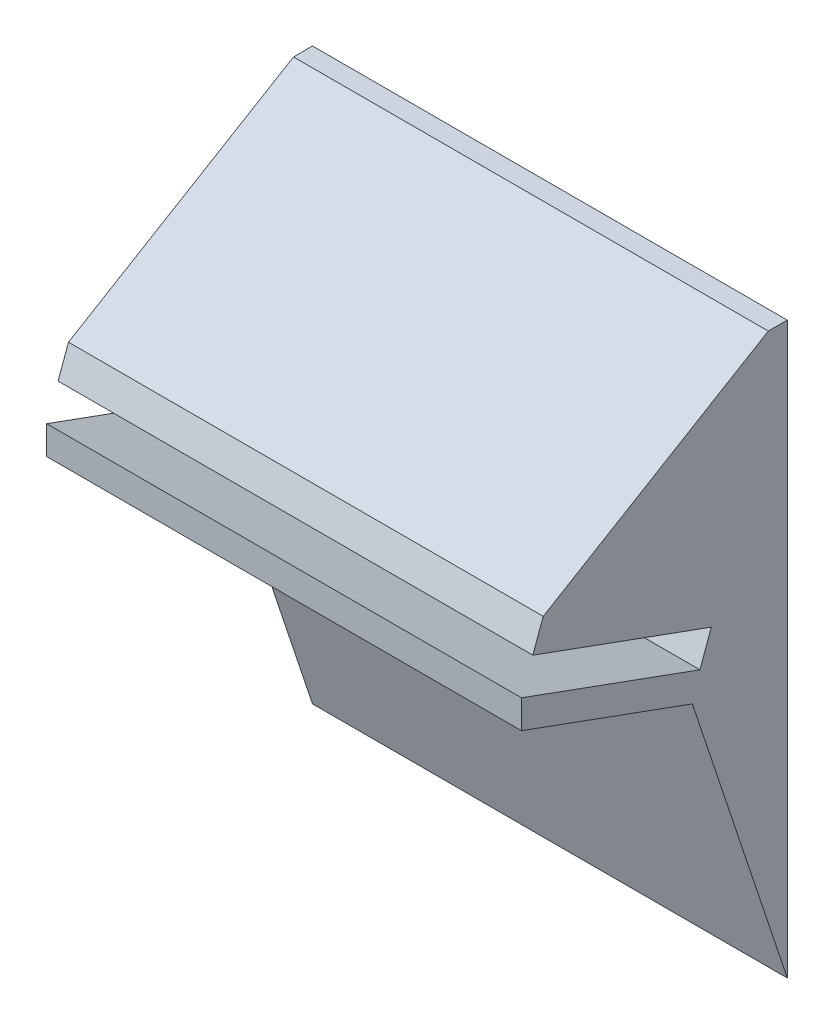
ISO-10303-21;
HEADER;
FILE_DESCRIPTION(('STEP AP214'),'2;1');
FILE_NAME('part.step','',(''),(''),'','','');
FILE_SCHEMA(('AUTOMOTIVE_DESIGN { 1 0 10303 214 1 1 1 1 }'));
ENDSEC;
DATA;
#1=APPLICATION_CONTEXT('core data for automotive mechanical design processes');
#2=APPLICATION_PROTOCOL_DEFINITION('international standard','automotive_design',2000,#1);
#3=PRODUCT_CONTEXT('',#1,'mechanical');
#4=PRODUCT('Part','Part','',(#3));
#5=PRODUCT_RELATED_PRODUCT_CATEGORY('part','',(#4));
#6=PRODUCT_DEFINITION_FORMATION('','',#4);
#7=PRODUCT_DEFINITION_CONTEXT('part definition',#1,'design');
#8=PRODUCT_DEFINITION('design','',#6,#7);
#9=PRODUCT_DEFINITION_SHAPE('','',#8);
#10=(LENGTH_UNIT() NAMED_UNIT(*) SI_UNIT(.MILLI.,.METRE.));
#11=(NAMED_UNIT(*) PLANE_ANGLE_UNIT() SI_UNIT($,.RADIAN.));
#12=(NAMED_UNIT(*) SI_UNIT($,.STERADIAN.) SOLID_ANGLE_UNIT());
#13=UNCERTAINTY_MEASURE_WITH_UNIT(LENGTH_MEASURE(1.E-05),#10,'distance_accuracy_value','');
#14=(GEOMETRIC_REPRESENTATION_CONTEXT(3) GLOBAL_UNCERTAINTY_ASSIGNED_CONTEXT((#13)) GLOBAL_UNIT_ASSIGNED_CONTEXT((#10,
#11,#12)) REPRESENTATION_CONTEXT('',''));
#15=CARTESIAN_POINT('',(0.,0.,0.));
#16=DIRECTION('',(0.,0.,1.));
#17=DIRECTION('',(1.,0.,0.));
#18=AXIS2_PLACEMENT_3D('',#15,#16,#17);
#19=CARTESIAN_POINT('',(0.,0.,2.));
#20=DIRECTION('',(1.,0.,0.));
#21=DIRECTION('',(0.,0.,-1.));
#22=AXIS2_PLACEMENT_3D('',#19,#20,#21);
#23=PLANE('',#22);
#24=DIRECTION('',(0.,-1.,0.));
#25=VECTOR('',#24,1.);
#26=CARTESIAN_POINT('',(0.,0.,0.));
#27=LINE('',#26,#25);
#28=CARTESIAN_POINT('',(0.,30.,0.));
#29=VERTEX_POINT('',#28);
#30=CARTESIAN_POINT('',(0.,-30.,0.));
#31=VERTEX_POINT('',#30);
#32=EDGE_CURVE('E118',#29,#31,#27,.T.);
#33=ORIENTED_EDGE('',*,*,#32,.T.);
#34=DIRECTION('',(0.,0.948683298050514,0.316227766016838));
#35=VECTOR('',#34,1.);
#36=CARTESIAN_POINT('',(0.,-30.,0.));
#37=LINE('',#36,#35);
#38=CARTESIAN_POINT('',(0.,0.,10.));
#39=VERTEX_POINT('',#38);
#40=EDGE_CURVE('E126',#31,#39,#37,.T.);
#41=ORIENTED_EDGE('',*,*,#40,.T.);
#42=DIRECTION('',(0.,0.342020143325673,0.939692620785907));
#43=VECTOR('',#42,1.);
#44=CARTESIAN_POINT('',(0.,0.,10.));
#45=LINE('',#44,#43);
#46=CARTESIAN_POINT('',(0.,6.54816042889604,27.9909229173579));
#47=VERTEX_POINT('',#46);
#48=EDGE_CURVE('E146',#39,#47,#45,.T.);
#49=ORIENTED_EDGE('',*,*,#48,.T.);
#50=DIRECTION('',(0.,1.,0.));
#51=VECTOR('',#50,1.);
#52=CARTESIAN_POINT('',(0.,6.54816042889604,27.9909229173579));
#53=LINE('',#52,#51);
#54=CARTESIAN_POINT('',(0.,9.54816042889604,27.9909229173579));
#55=VERTEX_POINT('',#54);
#56=EDGE_CURVE('E144',#47,#55,#53,.T.);
#57=ORIENTED_EDGE('',*,*,#56,.T.);
#58=DIRECTION('',(0.,-0.342020143325679,-0.939692620785905));
#59=VECTOR('',#58,1.);
#60=CARTESIAN_POINT('',(0.,9.54816042889604,27.9909229173579));
#61=LINE('',#60,#59);
#62=CARTESIAN_POINT('',(0.,2.70775756238245,9.19707050163985));
#63=VERTEX_POINT('',#62);
#64=EDGE_CURVE('E142',#55,#63,#61,.T.);
#65=ORIENTED_EDGE('',*,*,#64,.T.);
#66=DIRECTION('',(0.,0.939692620785907,-0.342020143325673));
#67=VECTOR('',#66,1.);
#68=CARTESIAN_POINT('',(0.,2.70775756238245,9.19707050163985));
#69=LINE('',#68,#67);
#70=CARTESIAN_POINT('',(0.,5.99668173513313,8.));
#71=VERTEX_POINT('',#70);
#72=EDGE_CURVE('E67',#63,#71,#69,.T.);
#73=ORIENTED_EDGE('',*,*,#72,.T.);
#74=DIRECTION('',(0.,0.342020143325673,0.939692620785907));
#75=VECTOR('',#74,1.);
#76=CARTESIAN_POINT('',(0.,5.99668173513313,8.));
#77=LINE('',#76,#75);
#78=CARTESIAN_POINT('',(0.,12.8370846016466,26.7938524157181));
#79=VERTEX_POINT('',#78);
#80=EDGE_CURVE('E62',#71,#79,#77,.T.);
#81=ORIENTED_EDGE('',*,*,#80,.T.);
#82=DIRECTION('',(0.,0.939692620785907,-0.342020143325673));
#83=VECTOR('',#82,1.);
#84=CARTESIAN_POINT('',(0.,12.8370846016466,26.7938524157181));
#85=LINE('',#84,#83);
#86=CARTESIAN_POINT('',(0.,15.8370846016466,25.7019417129195));
#87=VERTEX_POINT('',#86);
#88=EDGE_CURVE('E137',#79,#87,#85,.T.);
#89=ORIENTED_EDGE('',*,*,#88,.T.);
#90=DIRECTION('',(0.,0.512943701070108,-0.858422250138299));
#91=VECTOR('',#90,1.);
#92=CARTESIAN_POINT('',(0.,15.8370846016466,25.7019417129195));
#93=LINE('',#92,#91);
#94=CARTESIAN_POINT('',(0.,30.,2.));
#95=VERTEX_POINT('',#94);
#96=EDGE_CURVE('E148',#87,#95,#93,.T.);
#97=ORIENTED_EDGE('',*,*,#96,.T.);
#98=DIRECTION('',(0.,0.,-1.));
#99=VECTOR('',#98,1.);
#100=CARTESIAN_POINT('',(0.,30.,2.));
#101=LINE('',#100,#99);
#102=EDGE_CURVE('E41',#95,#29,#101,.T.);
#103=ORIENTED_EDGE('',*,*,#102,.T.);
#104=EDGE_LOOP('',(#33,#41,#49,#57,#65,#73,#81,#89,#97,#103));
#105=FACE_BOUND('',#104,.T.);
#106=ADVANCED_FACE('F33',(#105),#23,.F.);
#107=CARTESIAN_POINT('',(50.,0.,2.));
#108=DIRECTION('',(-1.,0.,0.));
#109=DIRECTION('',(0.,0.,1.));
#110=AXIS2_PLACEMENT_3D('',#107,#108,#109);
#111=PLANE('',#110);
#112=DIRECTION('',(0.,1.,0.));
#113=VECTOR('',#112,1.);
#114=CARTESIAN_POINT('',(50.,0.,0.));
#115=LINE('',#114,#113);
#116=CARTESIAN_POINT('',(50.,-30.,0.));
#117=VERTEX_POINT('',#116);
#118=CARTESIAN_POINT('',(50.,30.,0.));
#119=VERTEX_POINT('',#118);
#120=EDGE_CURVE('E55',#117,#119,#115,.T.);
#121=ORIENTED_EDGE('',*,*,#120,.T.);
#122=DIRECTION('',(0.,0.,-1.));
#123=VECTOR('',#122,1.);
#124=CARTESIAN_POINT('',(50.,30.,2.));
#125=LINE('',#124,#123);
#126=CARTESIAN_POINT('',(50.,30.,2.));
#127=VERTEX_POINT('',#126);
#128=EDGE_CURVE('E11',#127,#119,#125,.T.);
#129=ORIENTED_EDGE('',*,*,#128,.F.);
#130=DIRECTION('',(0.,-0.512943701070108,0.858422250138299));
#131=VECTOR('',#130,1.);
#132=CARTESIAN_POINT('',(50.,15.8370846016466,25.7019417129195));
#133=LINE('',#132,#131);
#134=CARTESIAN_POINT('',(50.,15.8370846016466,25.7019417129195));
#135=VERTEX_POINT('',#134);
#136=EDGE_CURVE('E136',#127,#135,#133,.T.);
#137=ORIENTED_EDGE('',*,*,#136,.T.);
#138=DIRECTION('',(0.,-0.939692620785907,0.342020143325673));
#139=VECTOR('',#138,1.);
#140=CARTESIAN_POINT('',(50.,12.8370846016466,26.7938524157181));
#141=LINE('',#140,#139);
#142=CARTESIAN_POINT('',(50.,12.8370846016466,26.7938524157181));
#143=VERTEX_POINT('',#142);
#144=EDGE_CURVE('E150',#135,#143,#141,.T.);
#145=ORIENTED_EDGE('',*,*,#144,.T.);
#146=DIRECTION('',(0.,-0.342020143325673,-0.939692620785907));
#147=VECTOR('',#146,1.);
#148=CARTESIAN_POINT('',(50.,5.99668173513313,8.));
#149=LINE('',#148,#147);
#150=CARTESIAN_POINT('',(50.,5.99668173513313,8.));
#151=VERTEX_POINT('',#150);
#152=EDGE_CURVE('E153',#143,#151,#149,.T.);
#153=ORIENTED_EDGE('',*,*,#152,.T.);
#154=DIRECTION('',(0.,-0.939692620785907,0.342020143325673));
#155=VECTOR('',#154,1.);
#156=CARTESIAN_POINT('',(50.,2.70775756238245,9.19707050163985));
#157=LINE('',#156,#155);
#158=CARTESIAN_POINT('',(50.,2.70775756238245,9.19707050163985));
#159=VERTEX_POINT('',#158);
#160=EDGE_CURVE('E156',#151,#159,#157,.T.);
#161=ORIENTED_EDGE('',*,*,#160,.T.);
#162=DIRECTION('',(0.,0.342020143325679,0.939692620785904));
#163=VECTOR('',#162,1.);
#164=CARTESIAN_POINT('',(50.,9.54816042889604,27.9909229173579));
#165=LINE('',#164,#163);
#166=CARTESIAN_POINT('',(50.,9.54816042889604,27.9909229173579));
#167=VERTEX_POINT('',#166);
#168=EDGE_CURVE('E159',#159,#167,#165,.T.);
#169=ORIENTED_EDGE('',*,*,#168,.T.);
#170=DIRECTION('',(0.,-1.,0.));
#171=VECTOR('',#170,1.);
#172=CARTESIAN_POINT('',(50.,6.54816042889604,27.9909229173579));
#173=LINE('',#172,#171);
#174=CARTESIAN_POINT('',(50.,6.54816042889604,27.9909229173579));
#175=VERTEX_POINT('',#174);
#176=EDGE_CURVE('E162',#167,#175,#173,.T.);
#177=ORIENTED_EDGE('',*,*,#176,.T.);
#178=DIRECTION('',(0.,-0.342020143325673,-0.939692620785907));
#179=VECTOR('',#178,1.);
#180=CARTESIAN_POINT('',(50.,0.,10.));
#181=LINE('',#180,#179);
#182=CARTESIAN_POINT('',(50.,0.,10.));
#183=VERTEX_POINT('',#182);
#184=EDGE_CURVE('E132',#175,#183,#181,.T.);
#185=ORIENTED_EDGE('',*,*,#184,.T.);
#186=DIRECTION('',(0.,-0.948683298050514,-0.316227766016838));
#187=VECTOR('',#186,1.);
#188=CARTESIAN_POINT('',(50.,-30.,0.));
#189=LINE('',#188,#187);
#190=EDGE_CURVE('E124',#183,#117,#189,.T.);
#191=ORIENTED_EDGE('',*,*,#190,.T.);
#192=EDGE_LOOP('',(#121,#129,#137,#145,#153,#161,#169,#177,#185,#191));
#193=FACE_BOUND('',#192,.T.);
#194=ADVANCED_FACE('F129',(#193),#111,.F.);
#195=CARTESIAN_POINT('',(0.,30.,2.));
#196=DIRECTION('',(0.,-1.,0.));
#197=DIRECTION('',(0.,0.,-1.));
#198=AXIS2_PLACEMENT_3D('',#195,#196,#197);
#199=PLANE('',#198);
#200=DIRECTION('',(-1.,0.,0.));
#201=VECTOR('',#200,1.);
#202=CARTESIAN_POINT('',(0.,30.,0.));
#203=LINE('',#202,#201);
#204=EDGE_CURVE('E117',#119,#29,#203,.T.);
#205=ORIENTED_EDGE('',*,*,#204,.T.);
#206=ORIENTED_EDGE('',*,*,#102,.F.);
#207=DIRECTION('',(-1.,0.,0.));
#208=VECTOR('',#207,1.);
#209=CARTESIAN_POINT('',(0.,30.,2.));
#210=LINE('',#209,#208);
#211=EDGE_CURVE('E180',#127,#95,#210,.T.);
#212=ORIENTED_EDGE('',*,*,#211,.F.);
#213=ORIENTED_EDGE('',*,*,#128,.T.);
#214=EDGE_LOOP('',(#205,#206,#212,#213));
#215=FACE_BOUND('',#214,.T.);
#216=ADVANCED_FACE('F187',(#215),#199,.F.);
#217=CARTESIAN_POINT('',(0.,0.,0.));
#218=DIRECTION('',(0.,0.,-1.));
#219=DIRECTION('',(-1.,0.,0.));
#220=AXIS2_PLACEMENT_3D('',#217,#218,#219);
#221=PLANE('',#220);
#222=ORIENTED_EDGE('',*,*,#32,.F.);
#223=ORIENTED_EDGE('',*,*,#204,.F.);
#224=ORIENTED_EDGE('',*,*,#120,.F.);
#225=DIRECTION('',(1.,0.,0.));
#226=VECTOR('',#225,1.);
#227=CARTESIAN_POINT('',(-31.6227766016838,-30.,0.));
#228=LINE('',#227,#226);
#229=EDGE_CURVE('E115',#31,#117,#228,.T.);
#230=ORIENTED_EDGE('',*,*,#229,.F.);
#231=EDGE_LOOP('',(#222,#223,#224,#230));
#232=FACE_BOUND('',#231,.T.);
#233=ADVANCED_FACE('F114',(#232),#221,.T.);
#234=CARTESIAN_POINT('',(-39.6929222166376,0.,10.));
#235=DIRECTION('',(0.,-0.939692620785907,0.342020143325673));
#236=DIRECTION('',(0.,-0.342020143325673,-0.939692620785907));
#237=AXIS2_PLACEMENT_3D('',#234,#235,#236);
#238=PLANE('',#237);
#239=ORIENTED_EDGE('',*,*,#48,.F.);
#240=DIRECTION('',(1.,0.,0.));
#241=VECTOR('',#240,1.);
#242=CARTESIAN_POINT('',(-39.6929222166376,0.,10.));
#243=LINE('',#242,#241);
#244=EDGE_CURVE('E139',#39,#183,#243,.T.);
#245=ORIENTED_EDGE('',*,*,#244,.T.);
#246=ORIENTED_EDGE('',*,*,#184,.F.);
#247=DIRECTION('',(1.,0.,0.));
#248=VECTOR('',#247,1.);
#249=CARTESIAN_POINT('',(-39.6929222166376,6.54816042889604,27.9909229173579));
#250=LINE('',#249,#248);
#251=EDGE_CURVE('E167',#47,#175,#250,.T.);
#252=ORIENTED_EDGE('',*,*,#251,.F.);
#253=EDGE_LOOP('',(#239,#245,#246,#252));
#254=FACE_BOUND('',#253,.T.);
#255=ADVANCED_FACE('F215',(#254),#238,.T.);
#256=CARTESIAN_POINT('',(-39.6929222166376,6.54816042889604,27.9909229173579));
#257=DIRECTION('',(0.,0.,1.));
#258=DIRECTION('',(1.,0.,0.));
#259=AXIS2_PLACEMENT_3D('',#256,#257,#258);
#260=PLANE('',#259);
#261=ORIENTED_EDGE('',*,*,#56,.F.);
#262=ORIENTED_EDGE('',*,*,#251,.T.);
#263=ORIENTED_EDGE('',*,*,#176,.F.);
#264=DIRECTION('',(1.,0.,0.));
#265=VECTOR('',#264,1.);
#266=CARTESIAN_POINT('',(-39.6929222166376,9.54816042889604,27.9909229173579));
#267=LINE('',#266,#265);
#268=EDGE_CURVE('E169',#55,#167,#267,.T.);
#269=ORIENTED_EDGE('',*,*,#268,.F.);
#270=EDGE_LOOP('',(#261,#262,#263,#269));
#271=FACE_BOUND('',#270,.T.);
#272=ADVANCED_FACE('F212',(#271),#260,.T.);
#273=CARTESIAN_POINT('',(-39.6929222166376,9.54816042889604,27.9909229173579));
#274=DIRECTION('',(0.,0.939692620785905,-0.342020143325679));
#275=DIRECTION('',(0.,0.342020143325679,0.939692620785905));
#276=AXIS2_PLACEMENT_3D('',#273,#274,#275);
#277=PLANE('',#276);
#278=ORIENTED_EDGE('',*,*,#64,.F.);
#279=ORIENTED_EDGE('',*,*,#268,.T.);
#280=ORIENTED_EDGE('',*,*,#168,.F.);
#281=DIRECTION('',(1.,0.,0.));
#282=VECTOR('',#281,1.);
#283=CARTESIAN_POINT('',(-39.6929222166376,2.70775756238245,9.19707050163985));
#284=LINE('',#283,#282);
#285=EDGE_CURVE('E171',#63,#159,#284,.T.);
#286=ORIENTED_EDGE('',*,*,#285,.F.);
#287=EDGE_LOOP('',(#278,#279,#280,#286));
#288=FACE_BOUND('',#287,.T.);
#289=ADVANCED_FACE('F208',(#288),#277,.T.);
#290=CARTESIAN_POINT('',(-39.6929222166376,2.70775756238245,9.19707050163985));
#291=DIRECTION('',(0.,0.342020143325673,0.939692620785907));
#292=DIRECTION('',(0.,-0.939692620785907,0.342020143325673));
#293=AXIS2_PLACEMENT_3D('',#290,#291,#292);
#294=PLANE('',#293);
#295=ORIENTED_EDGE('',*,*,#72,.F.);
#296=ORIENTED_EDGE('',*,*,#285,.T.);
#297=ORIENTED_EDGE('',*,*,#160,.F.);
#298=DIRECTION('',(1.,0.,0.));
#299=VECTOR('',#298,1.);
#300=CARTESIAN_POINT('',(-39.6929222166376,5.99668173513313,8.));
#301=LINE('',#300,#299);
#302=EDGE_CURVE('E173',#71,#151,#301,.T.);
#303=ORIENTED_EDGE('',*,*,#302,.F.);
#304=EDGE_LOOP('',(#295,#296,#297,#303));
#305=FACE_BOUND('',#304,.T.);
#306=ADVANCED_FACE('F202',(#305),#294,.T.);
#307=CARTESIAN_POINT('',(-39.6929222166376,5.99668173513313,8.));
#308=DIRECTION('',(0.,-0.939692620785907,0.342020143325673));
#309=DIRECTION('',(0.,-0.342020143325673,-0.939692620785907));
#310=AXIS2_PLACEMENT_3D('',#307,#308,#309);
#311=PLANE('',#310);
#312=ORIENTED_EDGE('',*,*,#80,.F.);
#313=ORIENTED_EDGE('',*,*,#302,.T.);
#314=ORIENTED_EDGE('',*,*,#152,.F.);
#315=DIRECTION('',(1.,0.,0.));
#316=VECTOR('',#315,1.);
#317=CARTESIAN_POINT('',(-39.6929222166376,12.8370846016466,26.7938524157181));
#318=LINE('',#317,#316);
#319=EDGE_CURVE('E175',#79,#143,#318,.T.);
#320=ORIENTED_EDGE('',*,*,#319,.F.);
#321=EDGE_LOOP('',(#312,#313,#314,#320));
#322=FACE_BOUND('',#321,.T.);
#323=ADVANCED_FACE('F198',(#322),#311,.T.);
#324=CARTESIAN_POINT('',(-39.6929222166376,12.8370846016466,26.7938524157181));
#325=DIRECTION('',(0.,0.342020143325673,0.939692620785907));
#326=DIRECTION('',(0.,-0.939692620785907,0.342020143325673));
#327=AXIS2_PLACEMENT_3D('',#324,#325,#326);
#328=PLANE('',#327);
#329=ORIENTED_EDGE('',*,*,#88,.F.);
#330=ORIENTED_EDGE('',*,*,#319,.T.);
#331=ORIENTED_EDGE('',*,*,#144,.F.);
#332=DIRECTION('',(1.,0.,0.));
#333=VECTOR('',#332,1.);
#334=CARTESIAN_POINT('',(-39.6929222166376,15.8370846016466,25.7019417129195));
#335=LINE('',#334,#333);
#336=EDGE_CURVE('E165',#87,#135,#335,.T.);
#337=ORIENTED_EDGE('',*,*,#336,.F.);
#338=EDGE_LOOP('',(#329,#330,#331,#337));
#339=FACE_BOUND('',#338,.T.);
#340=ADVANCED_FACE('F195',(#339),#328,.T.);
#341=CARTESIAN_POINT('',(-39.6929222166376,15.8370846016466,25.7019417129195));
#342=DIRECTION('',(0.,0.858422250138299,0.512943701070108));
#343=DIRECTION('',(0.,-0.512943701070108,0.858422250138299));
#344=AXIS2_PLACEMENT_3D('',#341,#342,#343);
#345=PLANE('',#344);
#346=ORIENTED_EDGE('',*,*,#96,.F.);
#347=ORIENTED_EDGE('',*,*,#336,.T.);
#348=ORIENTED_EDGE('',*,*,#136,.F.);
#349=ORIENTED_EDGE('',*,*,#211,.T.);
#350=EDGE_LOOP('',(#346,#347,#348,#349));
#351=FACE_BOUND('',#350,.T.);
#352=ADVANCED_FACE('F190',(#351),#345,.T.);
#353=CARTESIAN_POINT('',(-31.6227766016838,-30.,0.));
#354=DIRECTION('',(0.,-0.316227766016838,0.948683298050514));
#355=DIRECTION('',(0.,-0.948683298050514,-0.316227766016838));
#356=AXIS2_PLACEMENT_3D('',#353,#354,#355);
#357=PLANE('',#356);
#358=ORIENTED_EDGE('',*,*,#40,.F.);
#359=ORIENTED_EDGE('',*,*,#229,.T.);
#360=ORIENTED_EDGE('',*,*,#190,.F.);
#361=ORIENTED_EDGE('',*,*,#244,.F.);
#362=EDGE_LOOP('',(#358,#359,#360,#361));
#363=FACE_BOUND('',#362,.T.);
#364=ADVANCED_FACE('F122',(#363),#357,.T.);
#365=CLOSED_SHELL('',(#106,#194,#216,#233,#255,#272,#289,#306,#323,#340,#352,#364));
#366=MANIFOLD_SOLID_BREP('B2',#365);
#367=ADVANCED_BREP_SHAPE_REPRESENTATION('',(#18,#366),#14);
#368=SHAPE_DEFINITION_REPRESENTATION(#9,#367);
ENDSEC;
END-ISO-10303-21;
